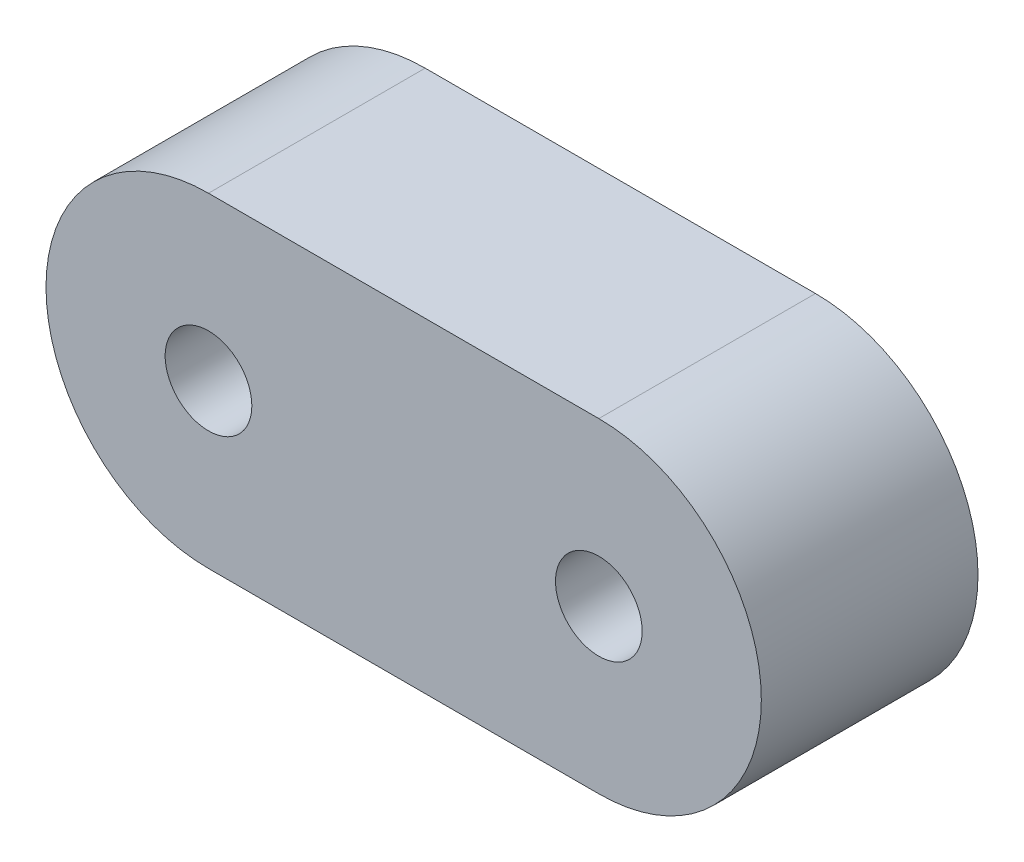
ISO-10303-21;
HEADER;
FILE_DESCRIPTION(('STEP AP214'),'2;1');
FILE_NAME('part.step','',(''),(''),'','','');
FILE_SCHEMA(('AUTOMOTIVE_DESIGN { 1 0 10303 214 1 1 1 1 }'));
ENDSEC;
DATA;
#1=APPLICATION_CONTEXT('core data for automotive mechanical design processes');
#2=APPLICATION_PROTOCOL_DEFINITION('international standard','automotive_design',2000,#1);
#3=PRODUCT_CONTEXT('',#1,'mechanical');
#4=PRODUCT('Part','Part','',(#3));
#5=PRODUCT_RELATED_PRODUCT_CATEGORY('part','',(#4));
#6=PRODUCT_DEFINITION_FORMATION('','',#4);
#7=PRODUCT_DEFINITION_CONTEXT('part definition',#1,'design');
#8=PRODUCT_DEFINITION('design','',#6,#7);
#9=PRODUCT_DEFINITION_SHAPE('','',#8);
#10=(LENGTH_UNIT() NAMED_UNIT(*) SI_UNIT(.MILLI.,.METRE.));
#11=(NAMED_UNIT(*) PLANE_ANGLE_UNIT() SI_UNIT($,.RADIAN.));
#12=(NAMED_UNIT(*) SI_UNIT($,.STERADIAN.) SOLID_ANGLE_UNIT());
#13=UNCERTAINTY_MEASURE_WITH_UNIT(LENGTH_MEASURE(1.E-05),#10,'distance_accuracy_value','');
#14=(GEOMETRIC_REPRESENTATION_CONTEXT(3) GLOBAL_UNCERTAINTY_ASSIGNED_CONTEXT((#13)) GLOBAL_UNIT_ASSIGNED_CONTEXT((#10,
#11,#12)) REPRESENTATION_CONTEXT('',''));
#15=CARTESIAN_POINT('',(0.,0.,0.));
#16=DIRECTION('',(0.,0.,1.));
#17=DIRECTION('',(1.,0.,0.));
#18=AXIS2_PLACEMENT_3D('',#15,#16,#17);
#19=CARTESIAN_POINT('',(0.,0.,20.));
#20=DIRECTION('',(0.,0.,1.));
#21=DIRECTION('',(1.,0.,0.));
#22=AXIS2_PLACEMENT_3D('',#19,#20,#21);
#23=PLANE('',#22);
#24=CARTESIAN_POINT('',(0.,0.,20.));
#25=DIRECTION('',(0.,0.,1.));
#26=DIRECTION('',(1.,0.,0.));
#27=AXIS2_PLACEMENT_3D('',#24,#25,#26);
#28=CIRCLE('',#27,4.);
#29=CARTESIAN_POINT('',(4.,0.,20.));
#30=VERTEX_POINT('',#29);
#31=EDGE_CURVE('E118',#30,#30,#28,.T.);
#32=ORIENTED_EDGE('',*,*,#31,.F.);
#33=EDGE_LOOP('',(#32));
#34=FACE_BOUND('',#33,.T.);
#35=CARTESIAN_POINT('',(0.,0.,20.));
#36=DIRECTION('',(0.,0.,1.));
#37=DIRECTION('',(1.,0.,0.));
#38=AXIS2_PLACEMENT_3D('',#35,#36,#37);
#39=CIRCLE('',#38,15.);
#40=CARTESIAN_POINT('',(0.,15.,20.));
#41=VERTEX_POINT('',#40);
#42=CARTESIAN_POINT('',(0.,-15.,20.));
#43=VERTEX_POINT('',#42);
#44=EDGE_CURVE('E98',#41,#43,#39,.T.);
#45=ORIENTED_EDGE('',*,*,#44,.T.);
#46=DIRECTION('',(1.,0.,0.));
#47=VECTOR('',#46,1.);
#48=CARTESIAN_POINT('',(0.,-15.,20.));
#49=LINE('',#48,#47);
#50=CARTESIAN_POINT('',(36.03,-15.,20.));
#51=VERTEX_POINT('',#50);
#52=EDGE_CURVE('E93',#43,#51,#49,.T.);
#53=ORIENTED_EDGE('',*,*,#52,.T.);
#54=CARTESIAN_POINT('',(36.03,0.,20.));
#55=DIRECTION('',(0.,0.,1.));
#56=DIRECTION('',(1.,0.,0.));
#57=AXIS2_PLACEMENT_3D('',#54,#55,#56);
#58=CIRCLE('',#57,15.);
#59=CARTESIAN_POINT('',(36.03,15.,20.));
#60=VERTEX_POINT('',#59);
#61=EDGE_CURVE('E96',#51,#60,#58,.T.);
#62=ORIENTED_EDGE('',*,*,#61,.T.);
#63=DIRECTION('',(-1.,0.,0.));
#64=VECTOR('',#63,1.);
#65=CARTESIAN_POINT('',(0.,15.,20.));
#66=LINE('',#65,#64);
#67=EDGE_CURVE('E63',#60,#41,#66,.T.);
#68=ORIENTED_EDGE('',*,*,#67,.T.);
#69=EDGE_LOOP('',(#45,#53,#62,#68));
#70=FACE_BOUND('',#69,.T.);
#71=CARTESIAN_POINT('',(36.03,0.,20.));
#72=DIRECTION('',(0.,0.,1.));
#73=DIRECTION('',(1.,0.,0.));
#74=AXIS2_PLACEMENT_3D('',#71,#72,#73);
#75=CIRCLE('',#74,3.99999999999999);
#76=CARTESIAN_POINT('',(40.03,0.,20.));
#77=VERTEX_POINT('',#76);
#78=EDGE_CURVE('E140',#77,#77,#75,.T.);
#79=ORIENTED_EDGE('',*,*,#78,.F.);
#80=EDGE_LOOP('',(#79));
#81=FACE_BOUND('',#80,.T.);
#82=ADVANCED_FACE('F45',(#34,#70,#81),#23,.T.);
#83=CARTESIAN_POINT('',(0.,0.,0.));
#84=DIRECTION('',(0.,0.,1.));
#85=DIRECTION('',(1.,0.,0.));
#86=AXIS2_PLACEMENT_3D('',#83,#84,#85);
#87=PLANE('',#86);
#88=CARTESIAN_POINT('',(0.,0.,0.));
#89=DIRECTION('',(0.,0.,1.));
#90=DIRECTION('',(1.,0.,0.));
#91=AXIS2_PLACEMENT_3D('',#88,#89,#90);
#92=CIRCLE('',#91,15.);
#93=CARTESIAN_POINT('',(0.,15.,0.));
#94=VERTEX_POINT('',#93);
#95=CARTESIAN_POINT('',(0.,-15.,0.));
#96=VERTEX_POINT('',#95);
#97=EDGE_CURVE('E114',#94,#96,#92,.T.);
#98=ORIENTED_EDGE('',*,*,#97,.F.);
#99=DIRECTION('',(-1.,0.,0.));
#100=VECTOR('',#99,1.);
#101=CARTESIAN_POINT('',(0.,15.,0.));
#102=LINE('',#101,#100);
#103=CARTESIAN_POINT('',(36.03,15.,0.));
#104=VERTEX_POINT('',#103);
#105=EDGE_CURVE('E86',#104,#94,#102,.T.);
#106=ORIENTED_EDGE('',*,*,#105,.F.);
#107=CARTESIAN_POINT('',(36.03,0.,0.));
#108=DIRECTION('',(0.,0.,1.));
#109=DIRECTION('',(1.,0.,0.));
#110=AXIS2_PLACEMENT_3D('',#107,#108,#109);
#111=CIRCLE('',#110,15.);
#112=CARTESIAN_POINT('',(36.03,-15.,0.));
#113=VERTEX_POINT('',#112);
#114=EDGE_CURVE('E80',#113,#104,#111,.T.);
#115=ORIENTED_EDGE('',*,*,#114,.F.);
#116=DIRECTION('',(1.,0.,0.));
#117=VECTOR('',#116,1.);
#118=CARTESIAN_POINT('',(0.,-15.,0.));
#119=LINE('',#118,#117);
#120=EDGE_CURVE('E103',#96,#113,#119,.T.);
#121=ORIENTED_EDGE('',*,*,#120,.F.);
#122=EDGE_LOOP('',(#98,#106,#115,#121));
#123=FACE_BOUND('',#122,.T.);
#124=CARTESIAN_POINT('',(0.,0.,0.));
#125=DIRECTION('',(0.,0.,1.));
#126=DIRECTION('',(1.,0.,0.));
#127=AXIS2_PLACEMENT_3D('',#124,#125,#126);
#128=CIRCLE('',#127,4.);
#129=CARTESIAN_POINT('',(4.,0.,0.));
#130=VERTEX_POINT('',#129);
#131=EDGE_CURVE('E136',#130,#130,#128,.T.);
#132=ORIENTED_EDGE('',*,*,#131,.T.);
#133=EDGE_LOOP('',(#132));
#134=FACE_BOUND('',#133,.T.);
#135=CARTESIAN_POINT('',(36.03,0.,0.));
#136=DIRECTION('',(0.,0.,1.));
#137=DIRECTION('',(1.,0.,0.));
#138=AXIS2_PLACEMENT_3D('',#135,#136,#137);
#139=CIRCLE('',#138,3.99999999999999);
#140=CARTESIAN_POINT('',(40.03,0.,0.));
#141=VERTEX_POINT('',#140);
#142=EDGE_CURVE('E144',#141,#141,#139,.T.);
#143=ORIENTED_EDGE('',*,*,#142,.T.);
#144=EDGE_LOOP('',(#143));
#145=FACE_BOUND('',#144,.T.);
#146=ADVANCED_FACE('F131',(#123,#134,#145),#87,.F.);
#147=CARTESIAN_POINT('',(0.,0.,20.));
#148=DIRECTION('',(0.,0.,-1.));
#149=DIRECTION('',(-1.,0.,0.));
#150=AXIS2_PLACEMENT_3D('',#147,#148,#149);
#151=CYLINDRICAL_SURFACE('',#150,15.);
#152=ORIENTED_EDGE('',*,*,#97,.T.);
#153=DIRECTION('',(0.,0.,-1.));
#154=VECTOR('',#153,1.);
#155=CARTESIAN_POINT('',(0.,-15.,20.));
#156=LINE('',#155,#154);
#157=EDGE_CURVE('E11',#43,#96,#156,.T.);
#158=ORIENTED_EDGE('',*,*,#157,.F.);
#159=ORIENTED_EDGE('',*,*,#44,.F.);
#160=DIRECTION('',(0.,0.,-1.));
#161=VECTOR('',#160,1.);
#162=CARTESIAN_POINT('',(0.,15.,20.));
#163=LINE('',#162,#161);
#164=EDGE_CURVE('E110',#41,#94,#163,.T.);
#165=ORIENTED_EDGE('',*,*,#164,.T.);
#166=EDGE_LOOP('',(#152,#158,#159,#165));
#167=FACE_BOUND('',#166,.T.);
#168=ADVANCED_FACE('F47',(#167),#151,.T.);
#169=CARTESIAN_POINT('',(0.,-15.,20.));
#170=DIRECTION('',(0.,1.,0.));
#171=DIRECTION('',(-1.,0.,0.));
#172=AXIS2_PLACEMENT_3D('',#169,#170,#171);
#173=PLANE('',#172);
#174=ORIENTED_EDGE('',*,*,#120,.T.);
#175=DIRECTION('',(0.,0.,-1.));
#176=VECTOR('',#175,1.);
#177=CARTESIAN_POINT('',(36.03,-15.,20.));
#178=LINE('',#177,#176);
#179=EDGE_CURVE('E55',#51,#113,#178,.T.);
#180=ORIENTED_EDGE('',*,*,#179,.F.);
#181=ORIENTED_EDGE('',*,*,#52,.F.);
#182=ORIENTED_EDGE('',*,*,#157,.T.);
#183=EDGE_LOOP('',(#174,#180,#181,#182));
#184=FACE_BOUND('',#183,.T.);
#185=ADVANCED_FACE('F102',(#184),#173,.F.);
#186=CARTESIAN_POINT('',(36.03,0.,20.));
#187=DIRECTION('',(0.,0.,-1.));
#188=DIRECTION('',(-1.,0.,0.));
#189=AXIS2_PLACEMENT_3D('',#186,#187,#188);
#190=CYLINDRICAL_SURFACE('',#189,15.);
#191=ORIENTED_EDGE('',*,*,#114,.T.);
#192=DIRECTION('',(0.,0.,-1.));
#193=VECTOR('',#192,1.);
#194=CARTESIAN_POINT('',(36.03,15.,20.));
#195=LINE('',#194,#193);
#196=EDGE_CURVE('E105',#60,#104,#195,.T.);
#197=ORIENTED_EDGE('',*,*,#196,.F.);
#198=ORIENTED_EDGE('',*,*,#61,.F.);
#199=ORIENTED_EDGE('',*,*,#179,.T.);
#200=EDGE_LOOP('',(#191,#197,#198,#199));
#201=FACE_BOUND('',#200,.T.);
#202=ADVANCED_FACE('F106',(#201),#190,.T.);
#203=CARTESIAN_POINT('',(0.,15.,20.));
#204=DIRECTION('',(0.,-1.,0.));
#205=DIRECTION('',(1.,0.,0.));
#206=AXIS2_PLACEMENT_3D('',#203,#204,#205);
#207=PLANE('',#206);
#208=ORIENTED_EDGE('',*,*,#105,.T.);
#209=ORIENTED_EDGE('',*,*,#164,.F.);
#210=ORIENTED_EDGE('',*,*,#67,.F.);
#211=ORIENTED_EDGE('',*,*,#196,.T.);
#212=EDGE_LOOP('',(#208,#209,#210,#211));
#213=FACE_BOUND('',#212,.T.);
#214=ADVANCED_FACE('F128',(#213),#207,.F.);
#215=CARTESIAN_POINT('',(0.,0.,20.));
#216=DIRECTION('',(0.,0.,-1.));
#217=DIRECTION('',(-1.,0.,0.));
#218=AXIS2_PLACEMENT_3D('',#215,#216,#217);
#219=CYLINDRICAL_SURFACE('',#218,4.);
#220=ORIENTED_EDGE('',*,*,#31,.T.);
#221=EDGE_LOOP('',(#220));
#222=FACE_BOUND('',#221,.T.);
#223=ORIENTED_EDGE('',*,*,#131,.F.);
#224=EDGE_LOOP('',(#223));
#225=FACE_BOUND('',#224,.T.);
#226=ADVANCED_FACE('F163',(#222,#225),#219,.F.);
#227=CARTESIAN_POINT('',(36.03,0.,20.));
#228=DIRECTION('',(0.,0.,-1.));
#229=DIRECTION('',(-1.,0.,0.));
#230=AXIS2_PLACEMENT_3D('',#227,#228,#229);
#231=CYLINDRICAL_SURFACE('',#230,3.99999999999999);
#232=ORIENTED_EDGE('',*,*,#78,.T.);
#233=EDGE_LOOP('',(#232));
#234=FACE_BOUND('',#233,.T.);
#235=ORIENTED_EDGE('',*,*,#142,.F.);
#236=EDGE_LOOP('',(#235));
#237=FACE_BOUND('',#236,.T.);
#238=ADVANCED_FACE('F152',(#234,#237),#231,.F.);
#239=CLOSED_SHELL('',(#82,#146,#168,#185,#202,#214,#226,#238));
#240=MANIFOLD_SOLID_BREP('B2',#239);
#241=ADVANCED_BREP_SHAPE_REPRESENTATION('',(#18,#240),#14);
#242=SHAPE_DEFINITION_REPRESENTATION(#9,#241);
ENDSEC;
END-ISO-10303-21;
